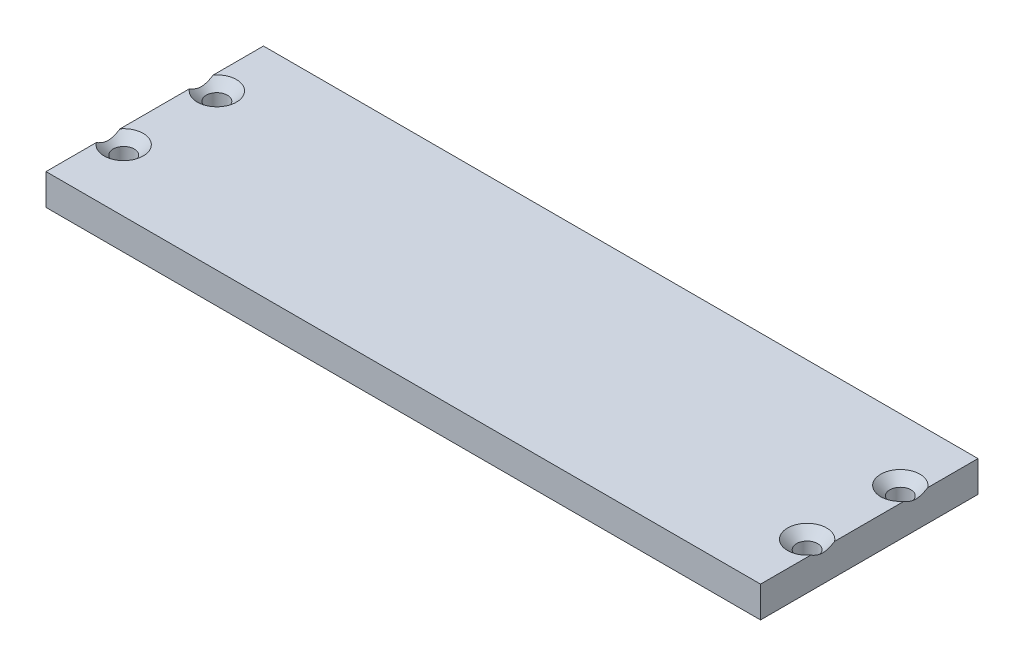
ISO-10303-21;
HEADER;
FILE_DESCRIPTION(('STEP AP214'),'2;1');
FILE_NAME('part.step','',(''),(''),'','','');
FILE_SCHEMA(('AUTOMOTIVE_DESIGN { 1 0 10303 214 1 1 1 1 }'));
ENDSEC;
DATA;
#1=APPLICATION_CONTEXT('core data for automotive mechanical design processes');
#2=APPLICATION_PROTOCOL_DEFINITION('international standard','automotive_design',2000,#1);
#3=PRODUCT_CONTEXT('',#1,'mechanical');
#4=PRODUCT('Part','Part','',(#3));
#5=PRODUCT_RELATED_PRODUCT_CATEGORY('part','',(#4));
#6=PRODUCT_DEFINITION_FORMATION('','',#4);
#7=PRODUCT_DEFINITION_CONTEXT('part definition',#1,'design');
#8=PRODUCT_DEFINITION('design','',#6,#7);
#9=PRODUCT_DEFINITION_SHAPE('','',#8);
#10=(LENGTH_UNIT() NAMED_UNIT(*) SI_UNIT(.MILLI.,.METRE.));
#11=(NAMED_UNIT(*) PLANE_ANGLE_UNIT() SI_UNIT($,.RADIAN.));
#12=(NAMED_UNIT(*) SI_UNIT($,.STERADIAN.) SOLID_ANGLE_UNIT());
#13=UNCERTAINTY_MEASURE_WITH_UNIT(LENGTH_MEASURE(1.E-05),#10,'distance_accuracy_value','');
#14=(GEOMETRIC_REPRESENTATION_CONTEXT(3) GLOBAL_UNCERTAINTY_ASSIGNED_CONTEXT((#13)) GLOBAL_UNIT_ASSIGNED_CONTEXT((#10,
#11,#12)) REPRESENTATION_CONTEXT('',''));
#15=CARTESIAN_POINT('',(0.,0.,0.));
#16=DIRECTION('',(0.,0.,1.));
#17=DIRECTION('',(1.,0.,0.));
#18=AXIS2_PLACEMENT_3D('',#15,#16,#17);
#19=CARTESIAN_POINT('',(0.,0.,0.));
#20=DIRECTION('',(0.,-1.,0.));
#21=DIRECTION('',(0.,0.,-1.));
#22=AXIS2_PLACEMENT_3D('',#19,#20,#21);
#23=PLANE('',#22);
#24=CARTESIAN_POINT('',(2.5,0.,-25.));
#25=DIRECTION('',(0.,1.,0.));
#26=DIRECTION('',(0.,0.,1.));
#27=AXIS2_PLACEMENT_3D('',#24,#25,#26);
#28=CIRCLE('',#27,3.15);
#29=CARTESIAN_POINT('',(0.,0.,-23.0836232103263));
#30=VERTEX_POINT('',#29);
#31=CARTESIAN_POINT('',(0.,0.,-26.9163767896737));
#32=VERTEX_POINT('',#31);
#33=EDGE_CURVE('E60',#30,#32,#28,.T.);
#34=ORIENTED_EDGE('',*,*,#33,.F.);
#35=DIRECTION('',(0.,0.,1.));
#36=VECTOR('',#35,1.);
#37=CARTESIAN_POINT('',(0.,0.,0.));
#38=LINE('',#37,#36);
#39=CARTESIAN_POINT('',(0.,0.,-11.9163767896737));
#40=VERTEX_POINT('',#39);
#41=EDGE_CURVE('E67',#30,#40,#38,.T.);
#42=ORIENTED_EDGE('',*,*,#41,.T.);
#43=CARTESIAN_POINT('',(2.5,0.,-10.));
#44=DIRECTION('',(0.,1.,0.));
#45=DIRECTION('',(0.,0.,1.));
#46=AXIS2_PLACEMENT_3D('',#43,#44,#45);
#47=CIRCLE('',#46,3.15);
#48=CARTESIAN_POINT('',(0.,0.,-8.08362321032632));
#49=VERTEX_POINT('',#48);
#50=EDGE_CURVE('E239',#49,#40,#47,.T.);
#51=ORIENTED_EDGE('',*,*,#50,.F.);
#52=CARTESIAN_POINT('',(0.,0.,0.));
#53=VERTEX_POINT('',#52);
#54=EDGE_CURVE('E122',#49,#53,#38,.T.);
#55=ORIENTED_EDGE('',*,*,#54,.T.);
#56=DIRECTION('',(1.,0.,0.));
#57=VECTOR('',#56,1.);
#58=CARTESIAN_POINT('',(0.,0.,0.));
#59=LINE('',#58,#57);
#60=CARTESIAN_POINT('',(115.,0.,0.));
#61=VERTEX_POINT('',#60);
#62=EDGE_CURVE('E128',#53,#61,#59,.T.);
#63=ORIENTED_EDGE('',*,*,#62,.T.);
#64=DIRECTION('',(0.,0.,-1.));
#65=VECTOR('',#64,1.);
#66=CARTESIAN_POINT('',(115.,0.,0.));
#67=LINE('',#66,#65);
#68=CARTESIAN_POINT('',(115.,0.,-8.08362321032634));
#69=VERTEX_POINT('',#68);
#70=EDGE_CURVE('E138',#61,#69,#67,.T.);
#71=ORIENTED_EDGE('',*,*,#70,.T.);
#72=CARTESIAN_POINT('',(112.5,0.,-10.));
#73=DIRECTION('',(0.,1.,0.));
#74=DIRECTION('',(0.,0.,1.));
#75=AXIS2_PLACEMENT_3D('',#72,#73,#74);
#76=CIRCLE('',#75,3.15);
#77=CARTESIAN_POINT('',(115.,0.,-11.9163767896737));
#78=VERTEX_POINT('',#77);
#79=EDGE_CURVE('E248',#78,#69,#76,.T.);
#80=ORIENTED_EDGE('',*,*,#79,.F.);
#81=CARTESIAN_POINT('',(115.,0.,-23.0836232103263));
#82=VERTEX_POINT('',#81);
#83=EDGE_CURVE('E143',#78,#82,#67,.T.);
#84=ORIENTED_EDGE('',*,*,#83,.T.);
#85=CARTESIAN_POINT('',(112.5,0.,-25.));
#86=DIRECTION('',(0.,1.,0.));
#87=DIRECTION('',(0.,0.,1.));
#88=AXIS2_PLACEMENT_3D('',#85,#86,#87);
#89=CIRCLE('',#88,3.15);
#90=CARTESIAN_POINT('',(115.,0.,-26.9163767896737));
#91=VERTEX_POINT('',#90);
#92=EDGE_CURVE('E229',#91,#82,#89,.T.);
#93=ORIENTED_EDGE('',*,*,#92,.F.);
#94=CARTESIAN_POINT('',(115.,0.,-35.));
#95=VERTEX_POINT('',#94);
#96=EDGE_CURVE('E137',#91,#95,#67,.T.);
#97=ORIENTED_EDGE('',*,*,#96,.T.);
#98=DIRECTION('',(-1.,0.,0.));
#99=VECTOR('',#98,1.);
#100=CARTESIAN_POINT('',(0.,0.,-35.));
#101=LINE('',#100,#99);
#102=CARTESIAN_POINT('',(0.,0.,-35.));
#103=VERTEX_POINT('',#102);
#104=EDGE_CURVE('E142',#95,#103,#101,.T.);
#105=ORIENTED_EDGE('',*,*,#104,.T.);
#106=EDGE_CURVE('E115',#103,#32,#38,.T.);
#107=ORIENTED_EDGE('',*,*,#106,.T.);
#108=EDGE_LOOP('',(#34,#42,#51,#55,#63,#71,#80,#84,#93,#97,#105,#107));
#109=FACE_BOUND('',#108,.T.);
#110=ADVANCED_FACE('F40',(#109),#23,.F.);
#111=CARTESIAN_POINT('',(0.,-5.,0.));
#112=DIRECTION('',(0.,-1.,0.));
#113=DIRECTION('',(0.,0.,-1.));
#114=AXIS2_PLACEMENT_3D('',#111,#112,#113);
#115=PLANE('',#114);
#116=CARTESIAN_POINT('',(2.5,-5.,-25.));
#117=DIRECTION('',(0.,1.,0.));
#118=DIRECTION('',(0.,0.,1.));
#119=AXIS2_PLACEMENT_3D('',#116,#117,#118);
#120=CIRCLE('',#119,1.7);
#121=CARTESIAN_POINT('',(2.5,-5.,-23.3));
#122=VERTEX_POINT('',#121);
#123=EDGE_CURVE('E210',#122,#122,#120,.T.);
#124=ORIENTED_EDGE('',*,*,#123,.T.);
#125=EDGE_LOOP('',(#124));
#126=FACE_BOUND('',#125,.T.);
#127=DIRECTION('',(0.,0.,1.));
#128=VECTOR('',#127,1.);
#129=CARTESIAN_POINT('',(0.,-5.,0.));
#130=LINE('',#129,#128);
#131=CARTESIAN_POINT('',(0.,-5.,-35.));
#132=VERTEX_POINT('',#131);
#133=CARTESIAN_POINT('',(0.,-5.,0.));
#134=VERTEX_POINT('',#133);
#135=EDGE_CURVE('E146',#132,#134,#130,.T.);
#136=ORIENTED_EDGE('',*,*,#135,.F.);
#137=DIRECTION('',(-1.,0.,0.));
#138=VECTOR('',#137,1.);
#139=CARTESIAN_POINT('',(0.,-5.,-35.));
#140=LINE('',#139,#138);
#141=CARTESIAN_POINT('',(115.,-5.,-35.));
#142=VERTEX_POINT('',#141);
#143=EDGE_CURVE('E132',#142,#132,#140,.T.);
#144=ORIENTED_EDGE('',*,*,#143,.F.);
#145=DIRECTION('',(0.,0.,-1.));
#146=VECTOR('',#145,1.);
#147=CARTESIAN_POINT('',(115.,-5.,0.));
#148=LINE('',#147,#146);
#149=CARTESIAN_POINT('',(115.,-5.,0.));
#150=VERTEX_POINT('',#149);
#151=EDGE_CURVE('E262',#150,#142,#148,.T.);
#152=ORIENTED_EDGE('',*,*,#151,.F.);
#153=DIRECTION('',(1.,0.,0.));
#154=VECTOR('',#153,1.);
#155=CARTESIAN_POINT('',(0.,-5.,0.));
#156=LINE('',#155,#154);
#157=EDGE_CURVE('E259',#134,#150,#156,.T.);
#158=ORIENTED_EDGE('',*,*,#157,.F.);
#159=EDGE_LOOP('',(#136,#144,#152,#158));
#160=FACE_BOUND('',#159,.T.);
#161=CARTESIAN_POINT('',(112.5,-5.,-10.));
#162=DIRECTION('',(0.,1.,0.));
#163=DIRECTION('',(0.,0.,1.));
#164=AXIS2_PLACEMENT_3D('',#161,#162,#163);
#165=CIRCLE('',#164,1.69999999999999);
#166=CARTESIAN_POINT('',(112.5,-5.,-8.30000000000001));
#167=VERTEX_POINT('',#166);
#168=EDGE_CURVE('E129',#167,#167,#165,.T.);
#169=ORIENTED_EDGE('',*,*,#168,.T.);
#170=EDGE_LOOP('',(#169));
#171=FACE_BOUND('',#170,.T.);
#172=CARTESIAN_POINT('',(112.5,-5.,-25.));
#173=DIRECTION('',(0.,1.,0.));
#174=DIRECTION('',(0.,0.,1.));
#175=AXIS2_PLACEMENT_3D('',#172,#173,#174);
#176=CIRCLE('',#175,1.69999999999999);
#177=CARTESIAN_POINT('',(112.5,-5.,-23.3));
#178=VERTEX_POINT('',#177);
#179=EDGE_CURVE('E223',#178,#178,#176,.T.);
#180=ORIENTED_EDGE('',*,*,#179,.T.);
#181=EDGE_LOOP('',(#180));
#182=FACE_BOUND('',#181,.T.);
#183=CARTESIAN_POINT('',(2.5,-5.,-10.));
#184=DIRECTION('',(0.,1.,0.));
#185=DIRECTION('',(0.,0.,1.));
#186=AXIS2_PLACEMENT_3D('',#183,#184,#185);
#187=CIRCLE('',#186,1.7);
#188=CARTESIAN_POINT('',(2.5,-5.,-8.3));
#189=VERTEX_POINT('',#188);
#190=EDGE_CURVE('E226',#189,#189,#187,.T.);
#191=ORIENTED_EDGE('',*,*,#190,.T.);
#192=EDGE_LOOP('',(#191));
#193=FACE_BOUND('',#192,.T.);
#194=ADVANCED_FACE('F198',(#126,#160,#171,#182,#193),#115,.T.);
#195=CARTESIAN_POINT('',(0.,-5.,0.));
#196=DIRECTION('',(-1.,0.,0.));
#197=DIRECTION('',(0.,0.,1.));
#198=AXIS2_PLACEMENT_3D('',#195,#196,#197);
#199=PLANE('',#198);
#200=CARTESIAN_POINT('',(0.,2.14470506738386,-29.6673227604892));
#201=CARTESIAN_POINT('',(0.,2.04804038573964,-29.5576455291573));
#202=CARTESIAN_POINT('',(0.,1.95178340767227,-29.4476051730159));
#203=CARTESIAN_POINT('',(0.,1.76030441078791,-29.2266038689229));
#204=CARTESIAN_POINT('',(0.,1.66508252459353,-29.1156428061426));
#205=CARTESIAN_POINT('',(0.,1.47542063978899,-28.8920472480246));
#206=CARTESIAN_POINT('',(0.,1.38098738325443,-28.7794070219388));
#207=CARTESIAN_POINT('',(0.,1.19375450781671,-28.5527852582766));
#208=CARTESIAN_POINT('',(0.,1.10095479472035,-28.4388037986748));
#209=CARTESIAN_POINT('',(0.,0.911300374975573,-28.2014980260879));
#210=CARTESIAN_POINT('',(0.,0.814589313210295,-28.0780585222355));
#211=CARTESIAN_POINT('',(0.,0.624318910573126,-27.8287765439328));
#212=CARTESIAN_POINT('',(0.,0.53075932305634,-27.7029342587456));
#213=CARTESIAN_POINT('',(0.,0.348128832657598,-27.4484184910059));
#214=CARTESIAN_POINT('',(0.,0.259048883672372,-27.3197515355747));
#215=CARTESIAN_POINT('',(0.,0.086915246927128,-27.0584717595877));
#216=CARTESIAN_POINT('',(0.,0.00385889176520419,-26.9258607227125));
#217=CARTESIAN_POINT('',(0.,-0.128597655752127,-26.6983755764979));
#218=CARTESIAN_POINT('',(0.,-0.18032185251616,-26.6048617608502));
#219=CARTESIAN_POINT('',(0.,-0.278469932148582,-26.4150245683994));
#220=CARTESIAN_POINT('',(0.,-0.32489223739362,-26.3187003659903));
#221=CARTESIAN_POINT('',(0.,-0.410357261039295,-26.1239311978321));
#222=CARTESIAN_POINT('',(0.,-0.44946856916426,-26.0255167193119));
#223=CARTESIAN_POINT('',(0.,-0.518863822314618,-25.8256125361317));
#224=CARTESIAN_POINT('',(0.,-0.549153192881915,-25.724124764148));
#225=CARTESIAN_POINT('',(0.,-0.591533247046323,-25.5484150474986));
#226=CARTESIAN_POINT('',(0.,-0.606354808895325,-25.4748525283882));
#227=CARTESIAN_POINT('',(0.,-0.629797590769259,-25.3267412104027));
#228=CARTESIAN_POINT('',(0.,-0.638419946750271,-25.2521925947731));
#229=CARTESIAN_POINT('',(0.,-0.648997088570633,-25.1027552922653));
#230=CARTESIAN_POINT('',(0.,-0.650964113844464,-25.0278674835375));
#231=CARTESIAN_POINT('',(0.,-0.648153935760054,-24.8782161608349));
#232=CARTESIAN_POINT('',(0.,-0.643376365896327,-24.8034526538358));
#233=CARTESIAN_POINT('',(0.,-0.62738121329268,-24.6549945598021));
#234=CARTESIAN_POINT('',(0.,-0.616194857485037,-24.5812965534887));
#235=CARTESIAN_POINT('',(0.,-0.58796194872827,-24.4350277588885));
#236=CARTESIAN_POINT('',(0.,-0.57091386349659,-24.3624572705294));
#237=CARTESIAN_POINT('',(0.,-0.531614925585801,-24.2184912614131));
#238=CARTESIAN_POINT('',(0.,-0.509346653434915,-24.1471005505784));
#239=CARTESIAN_POINT('',(0.,-0.46040677015092,-24.0058670814294));
#240=CARTESIAN_POINT('',(0.,-0.433735413620179,-23.9360242338768));
#241=CARTESIAN_POINT('',(0.,-0.363010101352304,-23.7646866095353));
#242=CARTESIAN_POINT('',(0.,-0.316759942935128,-23.6641008743433));
#243=CARTESIAN_POINT('',(0.,-0.218125828273926,-23.4659614822295));
#244=CARTESIAN_POINT('',(0.,-0.165738206643067,-23.3684096816776));
#245=CARTESIAN_POINT('',(0.,-0.0561990245488877,-23.1757478680392));
#246=CARTESIAN_POINT('',(0.,0.000963010001079064,-23.0806438558348));
#247=CARTESIAN_POINT('',(0.,0.118841814640717,-22.8927081599856));
#248=CARTESIAN_POINT('',(0.,0.179557858404481,-22.7998760175047));
#249=CARTESIAN_POINT('',(0.,0.3046483904462,-22.6147717264334));
#250=CARTESIAN_POINT('',(0.,0.36906287623103,-22.5225267327215));
#251=CARTESIAN_POINT('',(0.,0.500129477280052,-22.3396411366363));
#252=CARTESIAN_POINT('',(0.,0.566781680204416,-22.2490005973287));
#253=CARTESIAN_POINT('',(0.,0.701771577343216,-22.0691864511182));
#254=CARTESIAN_POINT('',(0.,0.770106766972478,-21.9800109589332));
#255=CARTESIAN_POINT('',(0.,0.908213690897797,-21.8027873124904));
#256=CARTESIAN_POINT('',(0.,0.977985374060568,-21.7147391182858));
#257=CARTESIAN_POINT('',(0.,1.21671326046475,-21.4175603724222));
#258=CARTESIAN_POINT('',(0.,1.38842362698368,-21.2106431555065));
#259=CARTESIAN_POINT('',(0.,1.73615145442409,-20.8004510705346));
#260=CARTESIAN_POINT('',(0.,1.91216942278521,-20.5971766365353));
#261=CARTESIAN_POINT('',(0.,2.26722514821175,-20.1931702445731));
#262=CARTESIAN_POINT('',(0.,2.44626386779751,-19.9924391340919));
#263=CARTESIAN_POINT('',(0.,2.80646061614008,-19.5928864589447));
#264=CARTESIAN_POINT('',(0.,2.98761868106821,-19.3940649269755));
#265=CARTESIAN_POINT('',(0.,3.35181816484022,-18.9975172743651));
#266=CARTESIAN_POINT('',(0.,3.53486231447148,-18.7997936648681));
#267=CARTESIAN_POINT('',(0.,3.90215008698825,-18.4054609403437));
#268=CARTESIAN_POINT('',(0.,4.08639372301234,-18.2088518375682));
#269=CARTESIAN_POINT('',(0.,4.64042891389232,-17.620407032647));
#270=CARTESIAN_POINT('',(0.,5.0116008268771,-17.229871498623));
#271=CARTESIAN_POINT('',(0.,5.71402805252223,-16.4952324026566));
#272=CARTESIAN_POINT('',(0.,6.04503321308733,-16.1508889854455));
#273=CARTESIAN_POINT('',(0.,6.70837915693933,-15.4634502173727));
#274=CARTESIAN_POINT('',(0.,7.04072002146204,-15.1203549449152));
#275=CARTESIAN_POINT('',(0.,7.70542483235973,-14.4360589415294));
#276=CARTESIAN_POINT('',(0.,8.03778608943344,-14.0948555960585));
#277=CARTESIAN_POINT('',(0.,8.70322099771821,-13.4131901175498));
#278=CARTESIAN_POINT('',(0.,9.03629459818934,-13.0727279349908));
#279=CARTESIAN_POINT('',(0.,9.36962703861058,-12.7325201778887));
#280=B_SPLINE_CURVE_WITH_KNOTS('',3,(#200,#201,#202,#203,#204,#205,#206,#207,#208,#209,#210,
#211,#212,#213,#214,#215,#216,#217,#218,#219,#220,#221,#222,#223,#224,#225,#226,#227,#228,#229,
#230,#231,#232,#233,#234,#235,#236,#237,#238,#239,#240,#241,#242,#243,#244,#245,#246,#247,#248,
#249,#250,#251,#252,#253,#254,#255,#256,#257,#258,#259,#260,#261,#262,#263,#264,#265,#266,#267,
#268,#269,#270,#271,#272,#273,#274,#275,#276,#277,#278,#279),.UNSPECIFIED.,.F.,.F.,(4,2,2,2,2,2,
2,2,2,2,2,2,2,2,2,2,2,2,2,2,2,2,2,2,2,2,2,2,2,2,2,2,2,2,2,2,2,2,2,4),(0.,0.43859004658992,
0.877235641036943,1.31818722879922,1.75911330661537,2.22951563461658,2.69988106141642,
3.16925499196793,3.63841978626333,3.95889023477053,4.27945579492675,4.5968437034759,
4.91403600247657,5.13892838196224,5.36377954116465,5.58821696416133,5.81266658369638,
6.03603175809848,6.25945536561295,6.48363541332443,6.70780250266697,7.0396341991901,
7.37166509071613,7.70444455034518,8.03715623633872,8.374642617684,8.71214223515844,
9.04916678328733,9.38617935539353,10.192726469904,10.9993690581913,11.806273716728,
12.6131921670309,13.4215160892333,14.2298488803591,15.846178176558,17.2790848381215,
18.7120800073947,20.1410482748921,21.5699179391233),.UNSPECIFIED.);
#281=EDGE_CURVE('E11',#32,#30,#280,.T.);
#282=ORIENTED_EDGE('',*,*,#281,.F.);
#283=ORIENTED_EDGE('',*,*,#106,.F.);
#284=DIRECTION('',(0.,1.,0.));
#285=VECTOR('',#284,1.);
#286=CARTESIAN_POINT('',(0.,-5.,-35.));
#287=LINE('',#286,#285);
#288=EDGE_CURVE('E147',#132,#103,#287,.T.);
#289=ORIENTED_EDGE('',*,*,#288,.F.);
#290=ORIENTED_EDGE('',*,*,#135,.T.);
#291=DIRECTION('',(0.,1.,0.));
#292=VECTOR('',#291,1.);
#293=CARTESIAN_POINT('',(0.,-5.,0.));
#294=LINE('',#293,#292);
#295=EDGE_CURVE('E158',#134,#53,#294,.T.);
#296=ORIENTED_EDGE('',*,*,#295,.T.);
#297=ORIENTED_EDGE('',*,*,#54,.F.);
#298=CARTESIAN_POINT('',(0.,2.14470506738386,-14.6673227604892));
#299=CARTESIAN_POINT('',(0.,2.04804038573964,-14.5576455291573));
#300=CARTESIAN_POINT('',(0.,1.95178340767227,-14.4476051730159));
#301=CARTESIAN_POINT('',(0.,1.76030441078791,-14.2266038689229));
#302=CARTESIAN_POINT('',(0.,1.66508252459353,-14.1156428061426));
#303=CARTESIAN_POINT('',(0.,1.47542063978898,-13.8920472480246));
#304=CARTESIAN_POINT('',(0.,1.38098738325443,-13.7794070219388));
#305=CARTESIAN_POINT('',(0.,1.19375450781671,-13.5527852582765));
#306=CARTESIAN_POINT('',(0.,1.10095479472035,-13.4388037986748));
#307=CARTESIAN_POINT('',(0.,0.911300374975573,-13.2014980260879));
#308=CARTESIAN_POINT('',(0.,0.814589313210295,-13.0780585222355));
#309=CARTESIAN_POINT('',(0.,0.624318910573127,-12.8287765439328));
#310=CARTESIAN_POINT('',(0.,0.530759323056341,-12.7029342587456));
#311=CARTESIAN_POINT('',(0.,0.348128832657599,-12.4484184910059));
#312=CARTESIAN_POINT('',(0.,0.259048883672374,-12.3197515355747));
#313=CARTESIAN_POINT('',(0.,0.08691524692713,-12.0584717595877));
#314=CARTESIAN_POINT('',(0.,0.00385889176520559,-11.9258607227125));
#315=CARTESIAN_POINT('',(0.,-0.128597655752128,-11.6983755764979));
#316=CARTESIAN_POINT('',(0.,-0.180321852516162,-11.6048617608502));
#317=CARTESIAN_POINT('',(0.,-0.278469932148585,-11.4150245683994));
#318=CARTESIAN_POINT('',(0.,-0.324892237393623,-11.3187003659903));
#319=CARTESIAN_POINT('',(0.,-0.410357261039298,-11.1239311978321));
#320=CARTESIAN_POINT('',(0.,-0.449468569164264,-11.0255167193119));
#321=CARTESIAN_POINT('',(0.,-0.518863822314622,-10.8256125361317));
#322=CARTESIAN_POINT('',(0.,-0.549153192881918,-10.724124764148));
#323=CARTESIAN_POINT('',(0.,-0.591533247046325,-10.5484150474986));
#324=CARTESIAN_POINT('',(0.,-0.606354808895328,-10.4748525283882));
#325=CARTESIAN_POINT('',(0.,-0.629797590769261,-10.3267412104027));
#326=CARTESIAN_POINT('',(0.,-0.638419946750272,-10.2521925947731));
#327=CARTESIAN_POINT('',(0.,-0.648997088570633,-10.1027552922653));
#328=CARTESIAN_POINT('',(0.,-0.650964113844464,-10.0278674835375));
#329=CARTESIAN_POINT('',(0.,-0.648153935760054,-9.87821616083486));
#330=CARTESIAN_POINT('',(0.,-0.643376365896326,-9.80345265383574));
#331=CARTESIAN_POINT('',(0.,-0.627381213292678,-9.6549945598021));
#332=CARTESIAN_POINT('',(0.,-0.616194857485035,-9.58129655348871));
#333=CARTESIAN_POINT('',(0.,-0.587961948728266,-9.43502775888846));
#334=CARTESIAN_POINT('',(0.,-0.570913863496586,-9.36245727052943));
#335=CARTESIAN_POINT('',(0.,-0.531614925585796,-9.21849126141306));
#336=CARTESIAN_POINT('',(0.,-0.50934665343491,-9.14710055057835));
#337=CARTESIAN_POINT('',(0.,-0.460406770150915,-9.00586708142942));
#338=CARTESIAN_POINT('',(0.,-0.433735413620172,-8.93602423387683));
#339=CARTESIAN_POINT('',(0.,-0.363010101352294,-8.76468660953527));
#340=CARTESIAN_POINT('',(0.,-0.316759942935117,-8.66410087434326));
#341=CARTESIAN_POINT('',(0.,-0.218125828273912,-8.46596148222948));
#342=CARTESIAN_POINT('',(0.,-0.165738206643053,-8.36840968167753));
#343=CARTESIAN_POINT('',(0.,-0.0561990245488706,-8.17574786803921));
#344=CARTESIAN_POINT('',(0.,0.000963010001097956,-8.08064385583476));
#345=CARTESIAN_POINT('',(0.,0.11884181464074,-7.8927081599856));
#346=CARTESIAN_POINT('',(0.,0.179557858404506,-7.79987601750465));
#347=CARTESIAN_POINT('',(0.,0.304648390446228,-7.61477172643333));
#348=CARTESIAN_POINT('',(0.,0.369062876231059,-7.52252673272142));
#349=CARTESIAN_POINT('',(0.,0.500129477280084,-7.33964113663623));
#350=CARTESIAN_POINT('',(0.,0.56678168020445,-7.24900059732867));
#351=CARTESIAN_POINT('',(0.,0.701771577343252,-7.06918645111816));
#352=CARTESIAN_POINT('',(0.,0.770106766972516,-6.98001095893315));
#353=CARTESIAN_POINT('',(0.,0.908213690897837,-6.80278731249038));
#354=CARTESIAN_POINT('',(0.,0.977985374060609,-6.71473911828575));
#355=CARTESIAN_POINT('',(0.,1.21671326046479,-6.41756037242215));
#356=CARTESIAN_POINT('',(0.,1.38842362698372,-6.21064315550641));
#357=CARTESIAN_POINT('',(0.,1.73615145442413,-5.80045107053456));
#358=CARTESIAN_POINT('',(0.,1.91216942278525,-5.59717663653528));
#359=CARTESIAN_POINT('',(0.,2.26722514821179,-5.19317024457302));
#360=CARTESIAN_POINT('',(0.,2.44626386779755,-4.99243913409186));
#361=CARTESIAN_POINT('',(0.,2.80646061614012,-4.59288645894462));
#362=CARTESIAN_POINT('',(0.,2.98761868106825,-4.39406492697548));
#363=CARTESIAN_POINT('',(0.,3.35181816484026,-3.9975172743651));
#364=CARTESIAN_POINT('',(0.,3.53486231447151,-3.7997936648681));
#365=CARTESIAN_POINT('',(0.,3.90215008698829,-3.40546094034362));
#366=CARTESIAN_POINT('',(0.,4.08639372301238,-3.20885183756818));
#367=CARTESIAN_POINT('',(0.,4.64042891389236,-2.620407032647));
#368=CARTESIAN_POINT('',(0.,5.01160082687713,-2.22987149862296));
#369=CARTESIAN_POINT('',(0.,5.71402805252226,-1.49523240265653));
#370=CARTESIAN_POINT('',(0.,6.04503321308736,-1.1508889854455));
#371=CARTESIAN_POINT('',(0.,6.70837915693937,-0.463450217372664));
#372=CARTESIAN_POINT('',(0.,7.04072002146208,-0.120354944915131));
#373=CARTESIAN_POINT('',(0.,7.70542483235978,0.563941058470604));
#374=CARTESIAN_POINT('',(0.,8.03778608943348,0.905144403941563));
#375=CARTESIAN_POINT('',(0.,8.70322099771826,1.5868098824502));
#376=CARTESIAN_POINT('',(0.,9.03629459818939,1.92727206500923));
#377=CARTESIAN_POINT('',(0.,9.36962703861063,2.26747982211139));
#378=B_SPLINE_CURVE_WITH_KNOTS('',3,(#298,#299,#300,#301,#302,#303,#304,#305,#306,#307,#308,
#309,#310,#311,#312,#313,#314,#315,#316,#317,#318,#319,#320,#321,#322,#323,#324,#325,#326,#327,
#328,#329,#330,#331,#332,#333,#334,#335,#336,#337,#338,#339,#340,#341,#342,#343,#344,#345,#346,
#347,#348,#349,#350,#351,#352,#353,#354,#355,#356,#357,#358,#359,#360,#361,#362,#363,#364,#365,
#366,#367,#368,#369,#370,#371,#372,#373,#374,#375,#376,#377),.UNSPECIFIED.,.F.,.F.,(4,2,2,2,2,2,
2,2,2,2,2,2,2,2,2,2,2,2,2,2,2,2,2,2,2,2,2,2,2,2,2,2,2,2,2,2,2,2,2,4),(0.,0.438590046589921,
0.877235641036944,1.31818722879922,1.75911330661537,2.22951563461658,2.69988106141641,
3.16925499196792,3.63841978626333,3.95889023477054,4.27945579492676,4.59684370347591,
4.91403600247658,5.13892838196225,5.36377954116466,5.58821696416134,5.81266658369639,
6.03603175809849,6.25945536561297,6.48363541332445,6.70780250266699,7.03963419919013,
7.37166509071617,7.70444455034522,8.03715623633876,8.37464261768405,8.7121422351585,
9.04916678328739,9.3861793553936,10.1927264699041,10.9993690581913,11.806273716728,
12.613192167031,13.4215160892333,14.2298488803591,15.8461781765581,17.2790848381215,
18.7120800073948,20.1410482748921,21.5699179391234),.UNSPECIFIED.);
#379=EDGE_CURVE('E55',#40,#49,#378,.T.);
#380=ORIENTED_EDGE('',*,*,#379,.F.);
#381=ORIENTED_EDGE('',*,*,#41,.F.);
#382=EDGE_LOOP('',(#282,#283,#289,#290,#296,#297,#380,#381));
#383=FACE_BOUND('',#382,.T.);
#384=ADVANCED_FACE('F42',(#383),#199,.T.);
#385=CARTESIAN_POINT('',(0.,-5.,-35.));
#386=DIRECTION('',(0.,0.,-1.));
#387=DIRECTION('',(-1.,0.,0.));
#388=AXIS2_PLACEMENT_3D('',#385,#386,#387);
#389=PLANE('',#388);
#390=ORIENTED_EDGE('',*,*,#104,.F.);
#391=DIRECTION('',(0.,1.,0.));
#392=VECTOR('',#391,1.);
#393=CARTESIAN_POINT('',(115.,-5.,-35.));
#394=LINE('',#393,#392);
#395=EDGE_CURVE('E151',#142,#95,#394,.T.);
#396=ORIENTED_EDGE('',*,*,#395,.F.);
#397=ORIENTED_EDGE('',*,*,#143,.T.);
#398=ORIENTED_EDGE('',*,*,#288,.T.);
#399=EDGE_LOOP('',(#390,#396,#397,#398));
#400=FACE_BOUND('',#399,.T.);
#401=ADVANCED_FACE('F185',(#400),#389,.T.);
#402=CARTESIAN_POINT('',(115.,-5.,0.));
#403=DIRECTION('',(1.,0.,0.));
#404=DIRECTION('',(0.,0.,-1.));
#405=AXIS2_PLACEMENT_3D('',#402,#403,#404);
#406=PLANE('',#405);
#407=CARTESIAN_POINT('',(115.,2.14470505004971,-29.667322740825));
#408=CARTESIAN_POINT('',(115.,2.04804036895066,-29.5576455100086));
#409=CARTESIAN_POINT('',(115.,1.95178339142903,-29.4476051543825));
#410=CARTESIAN_POINT('',(115.,1.7603043956372,-29.2266038513203));
#411=CARTESIAN_POINT('',(115.,1.66508250998959,-29.1156427890554));
#412=CARTESIAN_POINT('',(115.,1.47542062628258,-28.8920472319717));
#413=CARTESIAN_POINT('',(115.,1.38098737029879,-28.7794070064048));
#414=CARTESIAN_POINT('',(115.,1.19375449596302,-28.5527852437818));
#415=CARTESIAN_POINT('',(115.,1.10095478341785,-28.4388037847003));
#416=CARTESIAN_POINT('',(115.,0.911300364928844,-28.2014980133376));
#417=CARTESIAN_POINT('',(115.,0.814589303865307,-28.0780585101917));
#418=CARTESIAN_POINT('',(115.,0.624318902620658,-27.8287765333141));
#419=CARTESIAN_POINT('',(115.,0.530759315794653,-27.7029342488456));
#420=CARTESIAN_POINT('',(115.,0.348128826755657,-27.4484184825611));
#421=CARTESIAN_POINT('',(115.,0.259048878439454,-27.3197515278664));
#422=CARTESIAN_POINT('',(115.,0.0869152429950716,-27.0584717533839));
#423=CARTESIAN_POINT('',(115.,0.00385888846501659,-26.9258607172765));
#424=CARTESIAN_POINT('',(115.,-0.128597657941277,-26.6983755725804));
#425=CARTESIAN_POINT('',(115.,-0.180321854215423,-26.6048617576746));
#426=CARTESIAN_POINT('',(115.,-0.278469932943068,-26.4150245667515));
#427=CARTESIAN_POINT('',(115.,-0.324892237773272,-26.3187003651283));
#428=CARTESIAN_POINT('',(115.,-0.410357260718955,-26.1239311985589));
#429=CARTESIAN_POINT('',(115.,-0.449468568555758,-26.0255167208401));
#430=CARTESIAN_POINT('',(115.,-0.518863821288728,-25.8256125393108));
#431=CARTESIAN_POINT('',(115.,-0.549153191726485,-25.7241247681764));
#432=CARTESIAN_POINT('',(115.,-0.591533245979592,-25.5484150524618));
#433=CARTESIAN_POINT('',(115.,-0.606354807953589,-25.4748525334193));
#434=CARTESIAN_POINT('',(115.,-0.629797590098011,-25.3267412155609));
#435=CARTESIAN_POINT('',(115.,-0.638419946224508,-25.2521925999904));
#436=CARTESIAN_POINT('',(115.,-0.648997088349812,-25.1027552975908));
#437=CARTESIAN_POINT('',(115.,-0.650964113783367,-25.0278674889121));
#438=CARTESIAN_POINT('',(115.,-0.648153936024556,-24.8782161662931));
#439=CARTESIAN_POINT('',(115.,-0.643376366326718,-24.8034526593284));
#440=CARTESIAN_POINT('',(115.,-0.627381214049774,-24.6549945653376));
#441=CARTESIAN_POINT('',(115.,-0.616194858401931,-24.5812965590329));
#442=CARTESIAN_POINT('',(115.,-0.58796194995318,-24.4350277644399));
#443=CARTESIAN_POINT('',(115.,-0.570913864869723,-24.3624572760795));
#444=CARTESIAN_POINT('',(115.,-0.531614927240798,-24.2184912669541));
#445=CARTESIAN_POINT('',(115.,-0.509346655223489,-24.1471005561117));
#446=CARTESIAN_POINT('',(115.,-0.460406772190859,-24.0058670869447));
#447=CARTESIAN_POINT('',(115.,-0.433735415777893,-23.9360242393816));
#448=CARTESIAN_POINT('',(115.,-0.363010104062554,-23.7646866156896));
#449=CARTESIAN_POINT('',(115.,-0.316759946124692,-23.6641008811355));
#450=CARTESIAN_POINT('',(115.,-0.218125832465422,-23.4659614902644));
#451=CARTESIAN_POINT('',(115.,-0.165738211357241,-23.3684096903171));
#452=CARTESIAN_POINT('',(115.,-0.0561990303350324,-23.1757478778675));
#453=CARTESIAN_POINT('',(115.,0.000963003665507877,-23.0806438662469));
#454=CARTESIAN_POINT('',(115.,0.118841807192806,-22.892708171549));
#455=CARTESIAN_POINT('',(115.,0.179557850393669,-22.7998760296354));
#456=CARTESIAN_POINT('',(115.,0.304648381295972,-22.6147717396932));
#457=CARTESIAN_POINT('',(115.,0.369062866504269,-22.5225267465429));
#458=CARTESIAN_POINT('',(115.,0.500129466396404,-22.3396411515741));
#459=CARTESIAN_POINT('',(115.,0.566781668740413,-22.2490006128212));
#460=CARTESIAN_POINT('',(115.,0.701771564718444,-22.0691864677136));
#461=CARTESIAN_POINT('',(115.,0.770106753767316,-21.980010976077));
#462=CARTESIAN_POINT('',(115.,0.908213676531522,-21.8027873307281));
#463=CARTESIAN_POINT('',(115.,0.97798535911357,-21.7147391370691));
#464=CARTESIAN_POINT('',(115.,1.21671324484346,-21.4175603914406));
#465=CARTESIAN_POINT('',(115.,1.38842361132055,-21.2106431742513));
#466=CARTESIAN_POINT('',(115.,1.73615143873484,-20.8004510887764));
#467=CARTESIAN_POINT('',(115.,1.9121694071117,-20.5971766545475));
#468=CARTESIAN_POINT('',(115.,2.26722513260609,-20.1931702621526));
#469=CARTESIAN_POINT('',(115.,2.446263852244,-19.9924391514684));
#470=CARTESIAN_POINT('',(115.,2.80646060071303,-19.592886475934));
#471=CARTESIAN_POINT('',(115.,2.98761866571548,-19.3940649437807));
#472=CARTESIAN_POINT('',(115.,3.35181814965524,-18.9975172908099));
#473=CARTESIAN_POINT('',(115.,3.53486229937999,-18.7997936811367));
#474=CARTESIAN_POINT('',(115.,3.90215007209407,-18.405460956269));
#475=CARTESIAN_POINT('',(115.,4.08639370822197,-18.2088518533265));
#476=CARTESIAN_POINT('',(115.,4.64042889942201,-17.6204070479162));
#477=CARTESIAN_POINT('',(115.,5.01160081263372,-17.2298715135798));
#478=CARTESIAN_POINT('',(115.,5.71402803827885,-16.4952324175004));
#479=CARTESIAN_POINT('',(115.,6.04503319861293,-16.1508890004849));
#480=CARTESIAN_POINT('',(115.,6.70837914200814,-15.4634502328069));
#481=CARTESIAN_POINT('',(115.,7.04072000630509,-15.1203549605487));
#482=CARTESIAN_POINT('',(115.,7.70542481674043,-14.4360589575792));
#483=CARTESIAN_POINT('',(115.,8.0377860735775,-14.094855612325));
#484=CARTESIAN_POINT('',(115.,8.70322098139064,-13.4131901342525));
#485=CARTESIAN_POINT('',(115.,9.03629458162679,-13.0727279519128));
#486=CARTESIAN_POINT('',(115.,9.36962702181372,-12.7325201950307));
#487=B_SPLINE_CURVE_WITH_KNOTS('',3,(#407,#408,#409,#410,#411,#412,#413,#414,#415,#416,#417,
#418,#419,#420,#421,#422,#423,#424,#425,#426,#427,#428,#429,#430,#431,#432,#433,#434,#435,#436,
#437,#438,#439,#440,#441,#442,#443,#444,#445,#446,#447,#448,#449,#450,#451,#452,#453,#454,#455,
#456,#457,#458,#459,#460,#461,#462,#463,#464,#465,#466,#467,#468,#469,#470,#471,#472,#473,#474,
#475,#476,#477,#478,#479,#480,#481,#482,#483,#484,#485,#486),.UNSPECIFIED.,.F.,.F.,(4,2,2,2,2,2,
2,2,2,2,2,2,2,2,2,2,2,2,2,2,2,2,2,2,2,2,2,2,2,2,2,2,2,2,2,2,2,2,2,4),(0.,0.438590044348321,
0.877235636553658,1.31818722206133,1.75911329762307,2.22951562265761,2.69988104649099,
3.16925497408391,3.63841976542308,3.95889021127381,4.27945576877061,4.59684367477399,
4.91403597123822,5.13892835059917,5.36377950967708,5.58821693253958,5.81266655193993,
6.03603172624373,6.25945533365957,6.48363538127271,6.70780247051754,7.03963416470476,
7.3716650538916,7.70444451117061,8.03715619481546,8.37464257378894,8.71214218889132,
9.04916673465532,9.38617930439661,10.1927264194553,10.9993690082935,11.8062736673883,
12.6131921182497,13.4215160410303,14.2298488327347,15.8461781300816,17.279084790742,
18.7120799591143,20.1410482256505,21.5699178889183),.UNSPECIFIED.);
#488=EDGE_CURVE('E170',#82,#91,#487,.F.);
#489=ORIENTED_EDGE('',*,*,#488,.F.);
#490=ORIENTED_EDGE('',*,*,#83,.F.);
#491=CARTESIAN_POINT('',(115.,2.14470505004971,-14.667322740825));
#492=CARTESIAN_POINT('',(115.,2.04804036895067,-14.5576455100086));
#493=CARTESIAN_POINT('',(115.,1.95178339142904,-14.4476051543825));
#494=CARTESIAN_POINT('',(115.,1.7603043956372,-14.2266038513203));
#495=CARTESIAN_POINT('',(115.,1.66508250998959,-14.1156427890554));
#496=CARTESIAN_POINT('',(115.,1.47542062628258,-13.8920472319717));
#497=CARTESIAN_POINT('',(115.,1.38098737029879,-13.7794070064048));
#498=CARTESIAN_POINT('',(115.,1.19375449596303,-13.5527852437818));
#499=CARTESIAN_POINT('',(115.,1.10095478341785,-13.4388037847003));
#500=CARTESIAN_POINT('',(115.,0.911300364928846,-13.2014980133376));
#501=CARTESIAN_POINT('',(115.,0.814589303865308,-13.0780585101917));
#502=CARTESIAN_POINT('',(115.,0.624318902620659,-12.8287765333141));
#503=CARTESIAN_POINT('',(115.,0.530759315794655,-12.7029342488456));
#504=CARTESIAN_POINT('',(115.,0.348128826755659,-12.4484184825611));
#505=CARTESIAN_POINT('',(115.,0.259048878439455,-12.3197515278664));
#506=CARTESIAN_POINT('',(115.,0.0869152429950726,-12.0584717533839));
#507=CARTESIAN_POINT('',(115.,0.00385888846501766,-11.9258607172765));
#508=CARTESIAN_POINT('',(115.,-0.128597657941275,-11.6983755725804));
#509=CARTESIAN_POINT('',(115.,-0.180321854215421,-11.6048617576746));
#510=CARTESIAN_POINT('',(115.,-0.278469932943065,-11.4150245667515));
#511=CARTESIAN_POINT('',(115.,-0.32489223777327,-11.3187003651283));
#512=CARTESIAN_POINT('',(115.,-0.410357260718953,-11.1239311985589));
#513=CARTESIAN_POINT('',(115.,-0.449468568555757,-11.0255167208401));
#514=CARTESIAN_POINT('',(115.,-0.518863821288727,-10.8256125393108));
#515=CARTESIAN_POINT('',(115.,-0.549153191726484,-10.7241247681764));
#516=CARTESIAN_POINT('',(115.,-0.591533245979591,-10.5484150524618));
#517=CARTESIAN_POINT('',(115.,-0.606354807953588,-10.4748525334193));
#518=CARTESIAN_POINT('',(115.,-0.629797590098011,-10.3267412155609));
#519=CARTESIAN_POINT('',(115.,-0.638419946224508,-10.2521925999904));
#520=CARTESIAN_POINT('',(115.,-0.648997088349812,-10.1027552975908));
#521=CARTESIAN_POINT('',(115.,-0.650964113783367,-10.0278674889122));
#522=CARTESIAN_POINT('',(115.,-0.648153936024556,-9.87821616629313));
#523=CARTESIAN_POINT('',(115.,-0.643376366326718,-9.80345265932842));
#524=CARTESIAN_POINT('',(115.,-0.627381214049774,-9.65499456533764));
#525=CARTESIAN_POINT('',(115.,-0.616194858401931,-9.5812965590329));
#526=CARTESIAN_POINT('',(115.,-0.587961949953181,-9.43502776443992));
#527=CARTESIAN_POINT('',(115.,-0.570913864869724,-9.36245727607951));
#528=CARTESIAN_POINT('',(115.,-0.5316149272408,-9.2184912669541));
#529=CARTESIAN_POINT('',(115.,-0.509346655223492,-9.14710055611171));
#530=CARTESIAN_POINT('',(115.,-0.460406772190862,-9.00586708694469));
#531=CARTESIAN_POINT('',(115.,-0.433735415777896,-8.93602423938166));
#532=CARTESIAN_POINT('',(115.,-0.363010104062557,-8.76468661568962));
#533=CARTESIAN_POINT('',(115.,-0.316759946124697,-8.66410088113552));
#534=CARTESIAN_POINT('',(115.,-0.218125832465429,-8.46596149026439));
#535=CARTESIAN_POINT('',(115.,-0.165738211357248,-8.36840969031713));
#536=CARTESIAN_POINT('',(115.,-0.0561990303350409,-8.17574787786748));
#537=CARTESIAN_POINT('',(115.,0.000963003665498532,-8.08064386624693));
#538=CARTESIAN_POINT('',(115.,0.118841807192796,-7.89270817154899));
#539=CARTESIAN_POINT('',(115.,0.179557850393658,-7.79987602963538));
#540=CARTESIAN_POINT('',(115.,0.304648381295959,-7.61477173969317));
#541=CARTESIAN_POINT('',(115.,0.369062866504255,-7.52252674654293));
#542=CARTESIAN_POINT('',(115.,0.500129466396389,-7.33964115157408));
#543=CARTESIAN_POINT('',(115.,0.566781668740397,-7.24900061282118));
#544=CARTESIAN_POINT('',(115.,0.701771564718426,-7.06918646771366));
#545=CARTESIAN_POINT('',(115.,0.770106753767298,-6.980010976077));
#546=CARTESIAN_POINT('',(115.,0.908213676531501,-6.80278733072818));
#547=CARTESIAN_POINT('',(115.,0.977985359113547,-6.71473913706915));
#548=CARTESIAN_POINT('',(115.,1.21671324484343,-6.4175603914406));
#549=CARTESIAN_POINT('',(115.,1.38842361132052,-6.21064317425138));
#550=CARTESIAN_POINT('',(115.,1.73615143873481,-5.8004510887764));
#551=CARTESIAN_POINT('',(115.,1.91216940711167,-5.5971766545475));
#552=CARTESIAN_POINT('',(115.,2.26722513260606,-5.19317026215261));
#553=CARTESIAN_POINT('',(115.,2.44626385224397,-4.99243915146848));
#554=CARTESIAN_POINT('',(115.,2.806460600713,-4.59288647593407));
#555=CARTESIAN_POINT('',(115.,2.98761866571545,-4.39406494378075));
#556=CARTESIAN_POINT('',(115.,3.35181814965521,-3.99751729080994));
#557=CARTESIAN_POINT('',(115.,3.53486229937996,-3.79979368113676));
#558=CARTESIAN_POINT('',(115.,3.90215007209404,-3.40546095626905));
#559=CARTESIAN_POINT('',(115.,4.08639370822194,-3.20885185332656));
#560=CARTESIAN_POINT('',(115.,4.64042889942198,-2.62040704791621));
#561=CARTESIAN_POINT('',(115.,5.0116008126337,-2.2298715135798));
#562=CARTESIAN_POINT('',(115.,5.71402803827883,-1.49523241750041));
#563=CARTESIAN_POINT('',(115.,6.04503319861291,-1.15088900048489));
#564=CARTESIAN_POINT('',(115.,6.70837914200812,-0.46345023280693));
#565=CARTESIAN_POINT('',(115.,7.04072000630506,-0.120354960548774));
#566=CARTESIAN_POINT('',(115.,7.7054248167404,0.563941042420796));
#567=CARTESIAN_POINT('',(115.,8.03778607357747,0.905144387675017));
#568=CARTESIAN_POINT('',(115.,8.70322098139062,1.58680986574751));
#569=CARTESIAN_POINT('',(115.,9.03629458162676,1.92727204808714));
#570=CARTESIAN_POINT('',(115.,9.3696270218137,2.26747980496924));
#571=B_SPLINE_CURVE_WITH_KNOTS('',3,(#491,#492,#493,#494,#495,#496,#497,#498,#499,#500,#501,
#502,#503,#504,#505,#506,#507,#508,#509,#510,#511,#512,#513,#514,#515,#516,#517,#518,#519,#520,
#521,#522,#523,#524,#525,#526,#527,#528,#529,#530,#531,#532,#533,#534,#535,#536,#537,#538,#539,
#540,#541,#542,#543,#544,#545,#546,#547,#548,#549,#550,#551,#552,#553,#554,#555,#556,#557,#558,
#559,#560,#561,#562,#563,#564,#565,#566,#567,#568,#569,#570),.UNSPECIFIED.,.F.,.F.,(4,2,2,2,2,2,
2,2,2,2,2,2,2,2,2,2,2,2,2,2,2,2,2,2,2,2,2,2,2,2,2,2,2,2,2,2,2,2,2,4),(0.,0.438590044348321,
0.877235636553658,1.31818722206134,1.75911329762308,2.22951562265762,2.699881046491,
3.16925497408392,3.63841976542309,3.95889021127381,4.27945576877061,4.59684367477399,
4.91403597123822,5.13892835059917,5.36377950967708,5.58821693253958,5.81266655193993,
6.03603172624373,6.25945533365957,6.4836353812727,6.70780247051753,7.03963416470476,
7.37166505389159,7.7044445111706,8.03715619481544,8.37464257378893,8.71214218889129,
9.0491667346553,9.38617930439658,10.1927264194552,10.9993690082935,11.8062736673883,
12.6131921182496,13.4215160410303,14.2298488327347,15.8461781300816,17.2790847907419,
18.7120799591143,20.1410482256505,21.5699178889182),.UNSPECIFIED.);
#572=EDGE_CURVE('E150',#69,#78,#571,.F.);
#573=ORIENTED_EDGE('',*,*,#572,.F.);
#574=ORIENTED_EDGE('',*,*,#70,.F.);
#575=DIRECTION('',(0.,1.,0.));
#576=VECTOR('',#575,1.);
#577=CARTESIAN_POINT('',(115.,-5.,0.));
#578=LINE('',#577,#576);
#579=EDGE_CURVE('E155',#150,#61,#578,.T.);
#580=ORIENTED_EDGE('',*,*,#579,.F.);
#581=ORIENTED_EDGE('',*,*,#151,.T.);
#582=ORIENTED_EDGE('',*,*,#395,.T.);
#583=ORIENTED_EDGE('',*,*,#96,.F.);
#584=EDGE_LOOP('',(#489,#490,#573,#574,#580,#581,#582,#583));
#585=FACE_BOUND('',#584,.T.);
#586=ADVANCED_FACE('F180',(#585),#406,.T.);
#587=CARTESIAN_POINT('',(0.,-5.,0.));
#588=DIRECTION('',(0.,0.,1.));
#589=DIRECTION('',(1.,0.,0.));
#590=AXIS2_PLACEMENT_3D('',#587,#588,#589);
#591=PLANE('',#590);
#592=ORIENTED_EDGE('',*,*,#62,.F.);
#593=ORIENTED_EDGE('',*,*,#295,.F.);
#594=ORIENTED_EDGE('',*,*,#157,.T.);
#595=ORIENTED_EDGE('',*,*,#579,.T.);
#596=EDGE_LOOP('',(#592,#593,#594,#595));
#597=FACE_BOUND('',#596,.T.);
#598=ADVANCED_FACE('F184',(#597),#591,.T.);
#599=CARTESIAN_POINT('',(112.5,0.,-10.));
#600=DIRECTION('',(0.,1.,0.));
#601=DIRECTION('',(0.,0.,1.));
#602=AXIS2_PLACEMENT_3D('',#599,#600,#601);
#603=CYLINDRICAL_SURFACE('',#602,1.69999999999999);
#604=ORIENTED_EDGE('',*,*,#168,.F.);
#605=EDGE_LOOP('',(#604));
#606=FACE_BOUND('',#605,.T.);
#607=CARTESIAN_POINT('',(112.5,-1.45,-10.));
#608=DIRECTION('',(0.,1.,0.));
#609=DIRECTION('',(0.,0.,1.));
#610=AXIS2_PLACEMENT_3D('',#607,#608,#609);
#611=CIRCLE('',#610,1.69999999999999);
#612=CARTESIAN_POINT('',(112.5,-1.45,-8.30000000000001));
#613=VERTEX_POINT('',#612);
#614=EDGE_CURVE('E251',#613,#613,#611,.T.);
#615=ORIENTED_EDGE('',*,*,#614,.T.);
#616=EDGE_LOOP('',(#615));
#617=FACE_BOUND('',#616,.T.);
#618=ADVANCED_FACE('F190',(#606,#617),#603,.F.);
#619=CARTESIAN_POINT('',(112.5,0.,-10.));
#620=DIRECTION('',(0.,1.,0.));
#621=DIRECTION('',(0.,0.,1.));
#622=AXIS2_PLACEMENT_3D('',#619,#620,#621);
#623=CONICAL_SURFACE('',#622,3.15,0.78539816339745);
#624=ORIENTED_EDGE('',*,*,#572,.T.);
#625=ORIENTED_EDGE('',*,*,#79,.T.);
#626=EDGE_LOOP('',(#624,#625));
#627=FACE_BOUND('',#626,.T.);
#628=ORIENTED_EDGE('',*,*,#614,.F.);
#629=EDGE_LOOP('',(#628));
#630=FACE_BOUND('',#629,.T.);
#631=ADVANCED_FACE('F176',(#627,#630),#623,.F.);
#632=CARTESIAN_POINT('',(112.5,0.,-25.));
#633=DIRECTION('',(0.,1.,0.));
#634=DIRECTION('',(0.,0.,1.));
#635=AXIS2_PLACEMENT_3D('',#632,#633,#634);
#636=CYLINDRICAL_SURFACE('',#635,1.69999999999999);
#637=ORIENTED_EDGE('',*,*,#179,.F.);
#638=EDGE_LOOP('',(#637));
#639=FACE_BOUND('',#638,.T.);
#640=CARTESIAN_POINT('',(112.5,-1.45,-25.));
#641=DIRECTION('',(0.,1.,0.));
#642=DIRECTION('',(0.,0.,1.));
#643=AXIS2_PLACEMENT_3D('',#640,#641,#642);
#644=CIRCLE('',#643,1.69999999999999);
#645=CARTESIAN_POINT('',(112.5,-1.45,-23.3));
#646=VERTEX_POINT('',#645);
#647=EDGE_CURVE('E236',#646,#646,#644,.T.);
#648=ORIENTED_EDGE('',*,*,#647,.T.);
#649=EDGE_LOOP('',(#648));
#650=FACE_BOUND('',#649,.T.);
#651=ADVANCED_FACE('F353',(#639,#650),#636,.F.);
#652=CARTESIAN_POINT('',(112.5,0.,-25.));
#653=DIRECTION('',(0.,1.,0.));
#654=DIRECTION('',(0.,0.,1.));
#655=AXIS2_PLACEMENT_3D('',#652,#653,#654);
#656=CONICAL_SURFACE('',#655,3.15,0.78539816339745);
#657=ORIENTED_EDGE('',*,*,#488,.T.);
#658=ORIENTED_EDGE('',*,*,#92,.T.);
#659=EDGE_LOOP('',(#657,#658));
#660=FACE_BOUND('',#659,.T.);
#661=ORIENTED_EDGE('',*,*,#647,.F.);
#662=EDGE_LOOP('',(#661));
#663=FACE_BOUND('',#662,.T.);
#664=ADVANCED_FACE('F359',(#660,#663),#656,.F.);
#665=CARTESIAN_POINT('',(2.5,0.,-10.));
#666=DIRECTION('',(0.,1.,0.));
#667=DIRECTION('',(0.,0.,1.));
#668=AXIS2_PLACEMENT_3D('',#665,#666,#667);
#669=CYLINDRICAL_SURFACE('',#668,1.7);
#670=ORIENTED_EDGE('',*,*,#190,.F.);
#671=EDGE_LOOP('',(#670));
#672=FACE_BOUND('',#671,.T.);
#673=CARTESIAN_POINT('',(2.5,-1.45,-10.));
#674=DIRECTION('',(0.,1.,0.));
#675=DIRECTION('',(0.,0.,1.));
#676=AXIS2_PLACEMENT_3D('',#673,#674,#675);
#677=CIRCLE('',#676,1.7);
#678=CARTESIAN_POINT('',(2.5,-1.45,-8.3));
#679=VERTEX_POINT('',#678);
#680=EDGE_CURVE('E230',#679,#679,#677,.T.);
#681=ORIENTED_EDGE('',*,*,#680,.T.);
#682=EDGE_LOOP('',(#681));
#683=FACE_BOUND('',#682,.T.);
#684=ADVANCED_FACE('F341',(#672,#683),#669,.F.);
#685=CARTESIAN_POINT('',(2.5,0.,-10.));
#686=DIRECTION('',(0.,1.,0.));
#687=DIRECTION('',(0.,0.,1.));
#688=AXIS2_PLACEMENT_3D('',#685,#686,#687);
#689=CONICAL_SURFACE('',#688,3.15,0.785398163397448);
#690=ORIENTED_EDGE('',*,*,#379,.T.);
#691=ORIENTED_EDGE('',*,*,#50,.T.);
#692=EDGE_LOOP('',(#690,#691));
#693=FACE_BOUND('',#692,.T.);
#694=ORIENTED_EDGE('',*,*,#680,.F.);
#695=EDGE_LOOP('',(#694));
#696=FACE_BOUND('',#695,.T.);
#697=ADVANCED_FACE('F333',(#693,#696),#689,.F.);
#698=CARTESIAN_POINT('',(2.5,0.,-25.));
#699=DIRECTION('',(0.,1.,0.));
#700=DIRECTION('',(0.,0.,1.));
#701=AXIS2_PLACEMENT_3D('',#698,#699,#700);
#702=CYLINDRICAL_SURFACE('',#701,1.7);
#703=ORIENTED_EDGE('',*,*,#123,.F.);
#704=EDGE_LOOP('',(#703));
#705=FACE_BOUND('',#704,.T.);
#706=CARTESIAN_POINT('',(2.5,-1.45,-25.));
#707=DIRECTION('',(0.,1.,0.));
#708=DIRECTION('',(0.,0.,1.));
#709=AXIS2_PLACEMENT_3D('',#706,#707,#708);
#710=CIRCLE('',#709,1.7);
#711=CARTESIAN_POINT('',(2.5,-1.45,-23.3));
#712=VERTEX_POINT('',#711);
#713=EDGE_CURVE('E117',#712,#712,#710,.T.);
#714=ORIENTED_EDGE('',*,*,#713,.T.);
#715=EDGE_LOOP('',(#714));
#716=FACE_BOUND('',#715,.T.);
#717=ADVANCED_FACE('F328',(#705,#716),#702,.F.);
#718=CARTESIAN_POINT('',(2.5,0.,-25.));
#719=DIRECTION('',(0.,1.,0.));
#720=DIRECTION('',(0.,0.,1.));
#721=AXIS2_PLACEMENT_3D('',#718,#719,#720);
#722=CONICAL_SURFACE('',#721,3.15,0.785398163397448);
#723=ORIENTED_EDGE('',*,*,#281,.T.);
#724=ORIENTED_EDGE('',*,*,#33,.T.);
#725=EDGE_LOOP('',(#723,#724));
#726=FACE_BOUND('',#725,.T.);
#727=ORIENTED_EDGE('',*,*,#713,.F.);
#728=EDGE_LOOP('',(#727));
#729=FACE_BOUND('',#728,.T.);
#730=ADVANCED_FACE('F109',(#726,#729),#722,.F.);
#731=CLOSED_SHELL('',(#110,#194,#384,#401,#586,#598,#618,#631,#651,#664,#684,#697,#717,#730));
#732=MANIFOLD_SOLID_BREP('B2',#731);
#733=ADVANCED_BREP_SHAPE_REPRESENTATION('',(#18,#732),#14);
#734=SHAPE_DEFINITION_REPRESENTATION(#9,#733);
ENDSEC;
END-ISO-10303-21;
